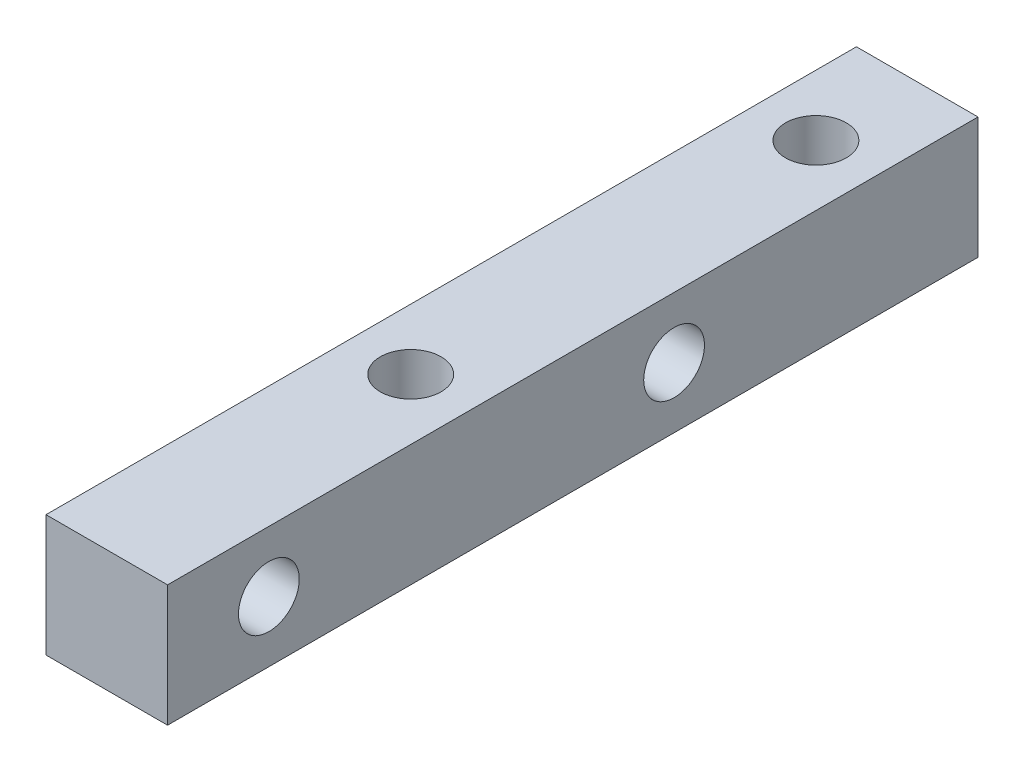
ISO-10303-21;
HEADER;
FILE_DESCRIPTION(('STEP AP214'),'2;1');
FILE_NAME('part.step','',(''),(''),'','','');
FILE_SCHEMA(('AUTOMOTIVE_DESIGN { 1 0 10303 214 1 1 1 1 }'));
ENDSEC;
DATA;
#1=APPLICATION_CONTEXT('core data for automotive mechanical design processes');
#2=APPLICATION_PROTOCOL_DEFINITION('international standard','automotive_design',2000,#1);
#3=PRODUCT_CONTEXT('',#1,'mechanical');
#4=PRODUCT('Part','Part','',(#3));
#5=PRODUCT_RELATED_PRODUCT_CATEGORY('part','',(#4));
#6=PRODUCT_DEFINITION_FORMATION('','',#4);
#7=PRODUCT_DEFINITION_CONTEXT('part definition',#1,'design');
#8=PRODUCT_DEFINITION('design','',#6,#7);
#9=PRODUCT_DEFINITION_SHAPE('','',#8);
#10=(LENGTH_UNIT() NAMED_UNIT(*) SI_UNIT(.MILLI.,.METRE.));
#11=(NAMED_UNIT(*) PLANE_ANGLE_UNIT() SI_UNIT($,.RADIAN.));
#12=(NAMED_UNIT(*) SI_UNIT($,.STERADIAN.) SOLID_ANGLE_UNIT());
#13=UNCERTAINTY_MEASURE_WITH_UNIT(LENGTH_MEASURE(1.E-05),#10,'distance_accuracy_value','');
#14=(GEOMETRIC_REPRESENTATION_CONTEXT(3) GLOBAL_UNCERTAINTY_ASSIGNED_CONTEXT((#13)) GLOBAL_UNIT_ASSIGNED_CONTEXT((#10,
#11,#12)) REPRESENTATION_CONTEXT('',''));
#15=CARTESIAN_POINT('',(0.,0.,0.));
#16=DIRECTION('',(0.,0.,1.));
#17=DIRECTION('',(1.,0.,0.));
#18=AXIS2_PLACEMENT_3D('',#15,#16,#17);
#19=CARTESIAN_POINT('',(0.,0.,40.));
#20=DIRECTION('',(1.,0.,0.));
#21=DIRECTION('',(0.,0.,-1.));
#22=AXIS2_PLACEMENT_3D('',#19,#20,#21);
#23=PLANE('',#22);
#24=CARTESIAN_POINT('',(0.,3.,35.));
#25=DIRECTION('',(-1.,0.,0.));
#26=DIRECTION('',(0.,0.,1.));
#27=AXIS2_PLACEMENT_3D('',#24,#25,#26);
#28=CIRCLE('',#27,1.5);
#29=CARTESIAN_POINT('',(0.,3.,36.5));
#30=VERTEX_POINT('',#29);
#31=EDGE_CURVE('E114',#30,#30,#28,.T.);
#32=ORIENTED_EDGE('',*,*,#31,.F.);
#33=EDGE_LOOP('',(#32));
#34=FACE_BOUND('',#33,.T.);
#35=CARTESIAN_POINT('',(0.,3.,15.));
#36=DIRECTION('',(-1.,0.,0.));
#37=DIRECTION('',(0.,0.,1.));
#38=AXIS2_PLACEMENT_3D('',#35,#36,#37);
#39=CIRCLE('',#38,1.5);
#40=CARTESIAN_POINT('',(0.,3.,16.5));
#41=VERTEX_POINT('',#40);
#42=EDGE_CURVE('E120',#41,#41,#39,.T.);
#43=ORIENTED_EDGE('',*,*,#42,.F.);
#44=EDGE_LOOP('',(#43));
#45=FACE_BOUND('',#44,.T.);
#46=DIRECTION('',(0.,-1.,0.));
#47=VECTOR('',#46,1.);
#48=CARTESIAN_POINT('',(0.,0.,0.));
#49=LINE('',#48,#47);
#50=CARTESIAN_POINT('',(0.,6.,0.));
#51=VERTEX_POINT('',#50);
#52=CARTESIAN_POINT('',(0.,0.,0.));
#53=VERTEX_POINT('',#52);
#54=EDGE_CURVE('E104',#51,#53,#49,.T.);
#55=ORIENTED_EDGE('',*,*,#54,.T.);
#56=DIRECTION('',(0.,0.,-1.));
#57=VECTOR('',#56,1.);
#58=CARTESIAN_POINT('',(0.,0.,40.));
#59=LINE('',#58,#57);
#60=CARTESIAN_POINT('',(0.,0.,40.));
#61=VERTEX_POINT('',#60);
#62=EDGE_CURVE('E11',#61,#53,#59,.T.);
#63=ORIENTED_EDGE('',*,*,#62,.F.);
#64=DIRECTION('',(0.,-1.,0.));
#65=VECTOR('',#64,1.);
#66=CARTESIAN_POINT('',(0.,0.,40.));
#67=LINE('',#66,#65);
#68=CARTESIAN_POINT('',(0.,6.,40.));
#69=VERTEX_POINT('',#68);
#70=EDGE_CURVE('E91',#69,#61,#67,.T.);
#71=ORIENTED_EDGE('',*,*,#70,.F.);
#72=DIRECTION('',(0.,0.,-1.));
#73=VECTOR('',#72,1.);
#74=CARTESIAN_POINT('',(0.,6.,40.));
#75=LINE('',#74,#73);
#76=EDGE_CURVE('E100',#69,#51,#75,.T.);
#77=ORIENTED_EDGE('',*,*,#76,.T.);
#78=EDGE_LOOP('',(#55,#63,#71,#77));
#79=FACE_BOUND('',#78,.T.);
#80=ADVANCED_FACE('F38',(#34,#45,#79),#23,.F.);
#81=CARTESIAN_POINT('',(0.,0.,40.));
#82=DIRECTION('',(0.,1.,0.));
#83=DIRECTION('',(0.,0.,1.));
#84=AXIS2_PLACEMENT_3D('',#81,#82,#83);
#85=PLANE('',#84);
#86=CARTESIAN_POINT('',(3.,0.,5.));
#87=DIRECTION('',(0.,1.,0.));
#88=DIRECTION('',(0.,0.,1.));
#89=AXIS2_PLACEMENT_3D('',#86,#87,#88);
#90=CIRCLE('',#89,1.5);
#91=CARTESIAN_POINT('',(3.,0.,6.5));
#92=VERTEX_POINT('',#91);
#93=EDGE_CURVE('E107',#92,#92,#90,.T.);
#94=ORIENTED_EDGE('',*,*,#93,.T.);
#95=EDGE_LOOP('',(#94));
#96=FACE_BOUND('',#95,.T.);
#97=CARTESIAN_POINT('',(3.,0.,25.));
#98=DIRECTION('',(0.,1.,0.));
#99=DIRECTION('',(0.,0.,1.));
#100=AXIS2_PLACEMENT_3D('',#97,#98,#99);
#101=CIRCLE('',#100,1.5);
#102=CARTESIAN_POINT('',(3.,0.,26.5));
#103=VERTEX_POINT('',#102);
#104=EDGE_CURVE('E130',#103,#103,#101,.T.);
#105=ORIENTED_EDGE('',*,*,#104,.T.);
#106=EDGE_LOOP('',(#105));
#107=FACE_BOUND('',#106,.T.);
#108=DIRECTION('',(1.,0.,0.));
#109=VECTOR('',#108,1.);
#110=CARTESIAN_POINT('',(0.,0.,0.));
#111=LINE('',#110,#109);
#112=CARTESIAN_POINT('',(6.,0.,0.));
#113=VERTEX_POINT('',#112);
#114=EDGE_CURVE('E95',#53,#113,#111,.T.);
#115=ORIENTED_EDGE('',*,*,#114,.T.);
#116=DIRECTION('',(0.,0.,-1.));
#117=VECTOR('',#116,1.);
#118=CARTESIAN_POINT('',(6.,0.,40.));
#119=LINE('',#118,#117);
#120=CARTESIAN_POINT('',(6.,0.,40.));
#121=VERTEX_POINT('',#120);
#122=EDGE_CURVE('E47',#121,#113,#119,.T.);
#123=ORIENTED_EDGE('',*,*,#122,.F.);
#124=DIRECTION('',(1.,0.,0.));
#125=VECTOR('',#124,1.);
#126=CARTESIAN_POINT('',(0.,0.,40.));
#127=LINE('',#126,#125);
#128=EDGE_CURVE('E86',#61,#121,#127,.T.);
#129=ORIENTED_EDGE('',*,*,#128,.F.);
#130=ORIENTED_EDGE('',*,*,#62,.T.);
#131=EDGE_LOOP('',(#115,#123,#129,#130));
#132=FACE_BOUND('',#131,.T.);
#133=ADVANCED_FACE('F94',(#96,#107,#132),#85,.F.);
#134=CARTESIAN_POINT('',(6.,0.,40.));
#135=DIRECTION('',(-1.,0.,0.));
#136=DIRECTION('',(0.,0.,1.));
#137=AXIS2_PLACEMENT_3D('',#134,#135,#136);
#138=PLANE('',#137);
#139=CARTESIAN_POINT('',(6.,3.,35.));
#140=DIRECTION('',(-1.,0.,0.));
#141=DIRECTION('',(0.,0.,1.));
#142=AXIS2_PLACEMENT_3D('',#139,#140,#141);
#143=CIRCLE('',#142,1.5);
#144=CARTESIAN_POINT('',(6.,3.,36.5));
#145=VERTEX_POINT('',#144);
#146=EDGE_CURVE('E41',#145,#145,#143,.T.);
#147=ORIENTED_EDGE('',*,*,#146,.T.);
#148=EDGE_LOOP('',(#147));
#149=FACE_BOUND('',#148,.T.);
#150=CARTESIAN_POINT('',(6.,3.,15.));
#151=DIRECTION('',(-1.,0.,0.));
#152=DIRECTION('',(0.,0.,1.));
#153=AXIS2_PLACEMENT_3D('',#150,#151,#152);
#154=CIRCLE('',#153,1.5);
#155=CARTESIAN_POINT('',(6.,3.,16.5));
#156=VERTEX_POINT('',#155);
#157=EDGE_CURVE('E112',#156,#156,#154,.T.);
#158=ORIENTED_EDGE('',*,*,#157,.T.);
#159=EDGE_LOOP('',(#158));
#160=FACE_BOUND('',#159,.T.);
#161=DIRECTION('',(0.,1.,0.));
#162=VECTOR('',#161,1.);
#163=CARTESIAN_POINT('',(6.,0.,0.));
#164=LINE('',#163,#162);
#165=CARTESIAN_POINT('',(6.,6.,0.));
#166=VERTEX_POINT('',#165);
#167=EDGE_CURVE('E73',#113,#166,#164,.T.);
#168=ORIENTED_EDGE('',*,*,#167,.T.);
#169=DIRECTION('',(0.,0.,-1.));
#170=VECTOR('',#169,1.);
#171=CARTESIAN_POINT('',(6.,6.,40.));
#172=LINE('',#171,#170);
#173=CARTESIAN_POINT('',(6.,6.,40.));
#174=VERTEX_POINT('',#173);
#175=EDGE_CURVE('E96',#174,#166,#172,.T.);
#176=ORIENTED_EDGE('',*,*,#175,.F.);
#177=DIRECTION('',(0.,1.,0.));
#178=VECTOR('',#177,1.);
#179=CARTESIAN_POINT('',(6.,0.,40.));
#180=LINE('',#179,#178);
#181=EDGE_CURVE('E89',#121,#174,#180,.T.);
#182=ORIENTED_EDGE('',*,*,#181,.F.);
#183=ORIENTED_EDGE('',*,*,#122,.T.);
#184=EDGE_LOOP('',(#168,#176,#182,#183));
#185=FACE_BOUND('',#184,.T.);
#186=ADVANCED_FACE('F98',(#149,#160,#185),#138,.F.);
#187=CARTESIAN_POINT('',(0.,6.,40.));
#188=DIRECTION('',(0.,-1.,0.));
#189=DIRECTION('',(0.,0.,-1.));
#190=AXIS2_PLACEMENT_3D('',#187,#188,#189);
#191=PLANE('',#190);
#192=CARTESIAN_POINT('',(3.,6.,5.));
#193=DIRECTION('',(0.,1.,0.));
#194=DIRECTION('',(0.,0.,1.));
#195=AXIS2_PLACEMENT_3D('',#192,#193,#194);
#196=CIRCLE('',#195,1.5);
#197=CARTESIAN_POINT('',(3.,6.,6.5));
#198=VERTEX_POINT('',#197);
#199=EDGE_CURVE('E127',#198,#198,#196,.T.);
#200=ORIENTED_EDGE('',*,*,#199,.F.);
#201=EDGE_LOOP('',(#200));
#202=FACE_BOUND('',#201,.T.);
#203=CARTESIAN_POINT('',(3.,6.,25.));
#204=DIRECTION('',(0.,1.,0.));
#205=DIRECTION('',(0.,0.,1.));
#206=AXIS2_PLACEMENT_3D('',#203,#204,#205);
#207=CIRCLE('',#206,1.5);
#208=CARTESIAN_POINT('',(3.,6.,26.5));
#209=VERTEX_POINT('',#208);
#210=EDGE_CURVE('E118',#209,#209,#207,.T.);
#211=ORIENTED_EDGE('',*,*,#210,.F.);
#212=EDGE_LOOP('',(#211));
#213=FACE_BOUND('',#212,.T.);
#214=DIRECTION('',(-1.,0.,0.));
#215=VECTOR('',#214,1.);
#216=CARTESIAN_POINT('',(0.,6.,0.));
#217=LINE('',#216,#215);
#218=EDGE_CURVE('E79',#166,#51,#217,.T.);
#219=ORIENTED_EDGE('',*,*,#218,.T.);
#220=ORIENTED_EDGE('',*,*,#76,.F.);
#221=DIRECTION('',(-1.,0.,0.));
#222=VECTOR('',#221,1.);
#223=CARTESIAN_POINT('',(0.,6.,40.));
#224=LINE('',#223,#222);
#225=EDGE_CURVE('E56',#174,#69,#224,.T.);
#226=ORIENTED_EDGE('',*,*,#225,.F.);
#227=ORIENTED_EDGE('',*,*,#175,.T.);
#228=EDGE_LOOP('',(#219,#220,#226,#227));
#229=FACE_BOUND('',#228,.T.);
#230=ADVANCED_FACE('F171',(#202,#213,#229),#191,.F.);
#231=CARTESIAN_POINT('',(0.,0.,40.));
#232=DIRECTION('',(0.,0.,-1.));
#233=DIRECTION('',(-1.,0.,0.));
#234=AXIS2_PLACEMENT_3D('',#231,#232,#233);
#235=PLANE('',#234);
#236=ORIENTED_EDGE('',*,*,#70,.T.);
#237=ORIENTED_EDGE('',*,*,#128,.T.);
#238=ORIENTED_EDGE('',*,*,#181,.T.);
#239=ORIENTED_EDGE('',*,*,#225,.T.);
#240=EDGE_LOOP('',(#236,#237,#238,#239));
#241=FACE_BOUND('',#240,.T.);
#242=ADVANCED_FACE('F87',(#241),#235,.F.);
#243=CARTESIAN_POINT('',(0.,0.,0.));
#244=DIRECTION('',(0.,0.,-1.));
#245=DIRECTION('',(-1.,0.,0.));
#246=AXIS2_PLACEMENT_3D('',#243,#244,#245);
#247=PLANE('',#246);
#248=ORIENTED_EDGE('',*,*,#54,.F.);
#249=ORIENTED_EDGE('',*,*,#218,.F.);
#250=ORIENTED_EDGE('',*,*,#167,.F.);
#251=ORIENTED_EDGE('',*,*,#114,.F.);
#252=EDGE_LOOP('',(#248,#249,#250,#251));
#253=FACE_BOUND('',#252,.T.);
#254=ADVANCED_FACE('F153',(#253),#247,.T.);
#255=CARTESIAN_POINT('',(3.,-44.,25.));
#256=DIRECTION('',(0.,1.,0.));
#257=DIRECTION('',(0.,0.,1.));
#258=AXIS2_PLACEMENT_3D('',#255,#256,#257);
#259=CYLINDRICAL_SURFACE('',#258,1.5);
#260=ORIENTED_EDGE('',*,*,#210,.T.);
#261=EDGE_LOOP('',(#260));
#262=FACE_BOUND('',#261,.T.);
#263=ORIENTED_EDGE('',*,*,#104,.F.);
#264=EDGE_LOOP('',(#263));
#265=FACE_BOUND('',#264,.T.);
#266=ADVANCED_FACE('F143',(#262,#265),#259,.F.);
#267=CARTESIAN_POINT('',(3.,-44.,5.));
#268=DIRECTION('',(0.,1.,0.));
#269=DIRECTION('',(0.,0.,1.));
#270=AXIS2_PLACEMENT_3D('',#267,#268,#269);
#271=CYLINDRICAL_SURFACE('',#270,1.5);
#272=ORIENTED_EDGE('',*,*,#199,.T.);
#273=EDGE_LOOP('',(#272));
#274=FACE_BOUND('',#273,.T.);
#275=ORIENTED_EDGE('',*,*,#93,.F.);
#276=EDGE_LOOP('',(#275));
#277=FACE_BOUND('',#276,.T.);
#278=ADVANCED_FACE('F140',(#274,#277),#271,.F.);
#279=CARTESIAN_POINT('',(50.,3.,15.));
#280=DIRECTION('',(-1.,0.,0.));
#281=DIRECTION('',(0.,0.,1.));
#282=AXIS2_PLACEMENT_3D('',#279,#280,#281);
#283=CYLINDRICAL_SURFACE('',#282,1.5);
#284=ORIENTED_EDGE('',*,*,#42,.T.);
#285=EDGE_LOOP('',(#284));
#286=FACE_BOUND('',#285,.T.);
#287=ORIENTED_EDGE('',*,*,#157,.F.);
#288=EDGE_LOOP('',(#287));
#289=FACE_BOUND('',#288,.T.);
#290=ADVANCED_FACE('F142',(#286,#289),#283,.F.);
#291=CARTESIAN_POINT('',(50.,3.,35.));
#292=DIRECTION('',(-1.,0.,0.));
#293=DIRECTION('',(0.,0.,1.));
#294=AXIS2_PLACEMENT_3D('',#291,#292,#293);
#295=CYLINDRICAL_SURFACE('',#294,1.5);
#296=ORIENTED_EDGE('',*,*,#31,.T.);
#297=EDGE_LOOP('',(#296));
#298=FACE_BOUND('',#297,.T.);
#299=ORIENTED_EDGE('',*,*,#146,.F.);
#300=EDGE_LOOP('',(#299));
#301=FACE_BOUND('',#300,.T.);
#302=ADVANCED_FACE('F150',(#298,#301),#295,.F.);
#303=CLOSED_SHELL('',(#80,#133,#186,#230,#242,#254,#266,#278,#290,#302));
#304=MANIFOLD_SOLID_BREP('B2',#303);
#305=ADVANCED_BREP_SHAPE_REPRESENTATION('',(#18,#304),#14);
#306=SHAPE_DEFINITION_REPRESENTATION(#9,#305);
ENDSEC;
END-ISO-10303-21;
